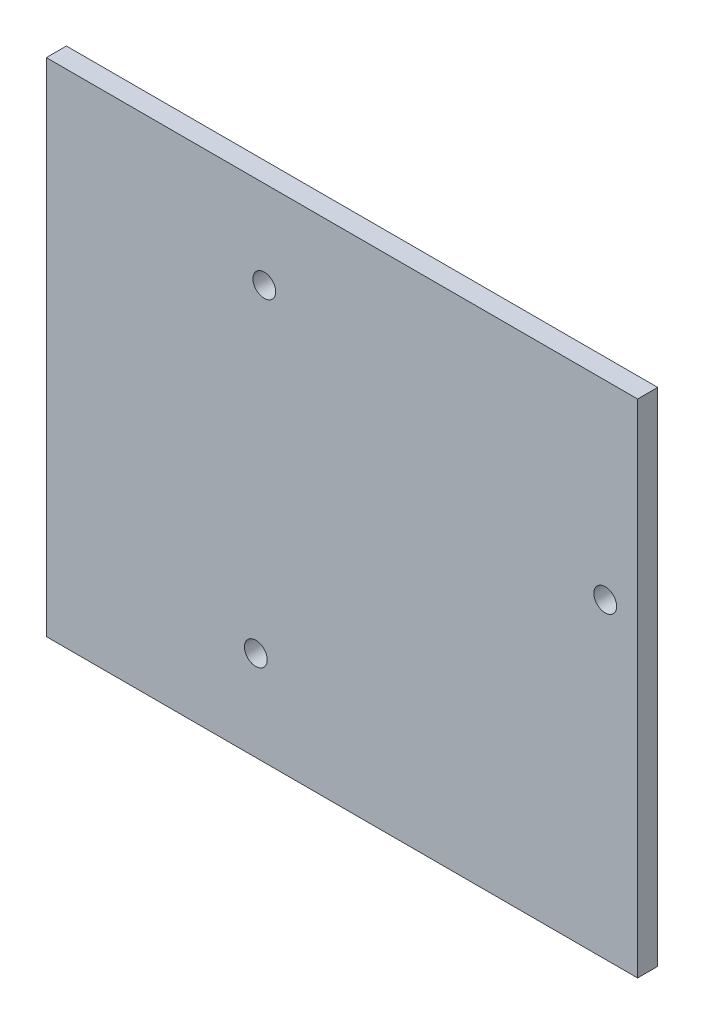
ISO-10303-21;
HEADER;
FILE_DESCRIPTION(('STEP AP214'),'2;1');
FILE_NAME('part.step','',(''),(''),'','','');
FILE_SCHEMA(('AUTOMOTIVE_DESIGN { 1 0 10303 214 1 1 1 1 }'));
ENDSEC;
DATA;
#1=APPLICATION_CONTEXT('core data for automotive mechanical design processes');
#2=APPLICATION_PROTOCOL_DEFINITION('international standard','automotive_design',2000,#1);
#3=PRODUCT_CONTEXT('',#1,'mechanical');
#4=PRODUCT('Part','Part','',(#3));
#5=PRODUCT_RELATED_PRODUCT_CATEGORY('part','',(#4));
#6=PRODUCT_DEFINITION_FORMATION('','',#4);
#7=PRODUCT_DEFINITION_CONTEXT('part definition',#1,'design');
#8=PRODUCT_DEFINITION('design','',#6,#7);
#9=PRODUCT_DEFINITION_SHAPE('','',#8);
#10=(LENGTH_UNIT() NAMED_UNIT(*) SI_UNIT(.MILLI.,.METRE.));
#11=(NAMED_UNIT(*) PLANE_ANGLE_UNIT() SI_UNIT($,.RADIAN.));
#12=(NAMED_UNIT(*) SI_UNIT($,.STERADIAN.) SOLID_ANGLE_UNIT());
#13=UNCERTAINTY_MEASURE_WITH_UNIT(LENGTH_MEASURE(1.E-05),#10,'distance_accuracy_value','');
#14=(GEOMETRIC_REPRESENTATION_CONTEXT(3) GLOBAL_UNCERTAINTY_ASSIGNED_CONTEXT((#13)) GLOBAL_UNIT_ASSIGNED_CONTEXT((#10,
#11,#12)) REPRESENTATION_CONTEXT('',''));
#15=CARTESIAN_POINT('',(0.,0.,0.));
#16=DIRECTION('',(0.,0.,1.));
#17=DIRECTION('',(1.,0.,0.));
#18=AXIS2_PLACEMENT_3D('',#15,#16,#17);
#19=CARTESIAN_POINT('',(30.9366243594386,-37.6115753760681,-3.));
#20=DIRECTION('',(1.,0.,0.));
#21=DIRECTION('',(0.,0.,-1.));
#22=AXIS2_PLACEMENT_3D('',#19,#20,#21);
#23=PLANE('',#22);
#24=DIRECTION('',(0.,1.,0.));
#25=VECTOR('',#24,1.);
#26=CARTESIAN_POINT('',(30.9366243594386,-37.6115753760681,0.));
#27=LINE('',#26,#25);
#28=CARTESIAN_POINT('',(30.9366243594386,-37.6115753760681,0.));
#29=VERTEX_POINT('',#28);
#30=CARTESIAN_POINT('',(30.9366243594386,37.2919327887527,0.));
#31=VERTEX_POINT('',#30);
#32=EDGE_CURVE('E98',#29,#31,#27,.T.);
#33=ORIENTED_EDGE('',*,*,#32,.F.);
#34=DIRECTION('',(0.,0.,1.));
#35=VECTOR('',#34,1.);
#36=CARTESIAN_POINT('',(30.9366243594386,-37.6115753760681,-3.));
#37=LINE('',#36,#35);
#38=CARTESIAN_POINT('',(30.9366243594386,-37.6115753760681,-3.));
#39=VERTEX_POINT('',#38);
#40=EDGE_CURVE('E11',#39,#29,#37,.T.);
#41=ORIENTED_EDGE('',*,*,#40,.F.);
#42=DIRECTION('',(0.,1.,0.));
#43=VECTOR('',#42,1.);
#44=CARTESIAN_POINT('',(30.9366243594386,-37.6115753760681,-3.));
#45=LINE('',#44,#43);
#46=CARTESIAN_POINT('',(30.9366243594386,37.2919327887527,-3.));
#47=VERTEX_POINT('',#46);
#48=EDGE_CURVE('E91',#39,#47,#45,.T.);
#49=ORIENTED_EDGE('',*,*,#48,.T.);
#50=DIRECTION('',(0.,0.,1.));
#51=VECTOR('',#50,1.);
#52=CARTESIAN_POINT('',(30.9366243594386,37.2919327887527,-3.));
#53=LINE('',#52,#51);
#54=EDGE_CURVE('E36',#47,#31,#53,.T.);
#55=ORIENTED_EDGE('',*,*,#54,.T.);
#56=EDGE_LOOP('',(#33,#41,#49,#55));
#57=FACE_BOUND('',#56,.T.);
#58=ADVANCED_FACE('F33',(#57),#23,.T.);
#59=CARTESIAN_POINT('',(30.9366243594386,-37.6115753760681,-3.));
#60=DIRECTION('',(0.,-1.,0.));
#61=DIRECTION('',(0.,0.,-1.));
#62=AXIS2_PLACEMENT_3D('',#59,#60,#61);
#63=PLANE('',#62);
#64=DIRECTION('',(1.,0.,0.));
#65=VECTOR('',#64,1.);
#66=CARTESIAN_POINT('',(30.9366243594386,-37.6115753760681,0.));
#67=LINE('',#66,#65);
#68=CARTESIAN_POINT('',(-57.3919791521353,-37.6115753760681,0.));
#69=VERTEX_POINT('',#68);
#70=EDGE_CURVE('E93',#69,#29,#67,.T.);
#71=ORIENTED_EDGE('',*,*,#70,.F.);
#72=DIRECTION('',(0.,0.,1.));
#73=VECTOR('',#72,1.);
#74=CARTESIAN_POINT('',(-57.3919791521353,-37.6115753760681,-3.));
#75=LINE('',#74,#73);
#76=CARTESIAN_POINT('',(-57.3919791521353,-37.6115753760681,-3.));
#77=VERTEX_POINT('',#76);
#78=EDGE_CURVE('E42',#77,#69,#75,.T.);
#79=ORIENTED_EDGE('',*,*,#78,.F.);
#80=DIRECTION('',(1.,0.,0.));
#81=VECTOR('',#80,1.);
#82=CARTESIAN_POINT('',(30.9366243594386,-37.6115753760681,-3.));
#83=LINE('',#82,#81);
#84=EDGE_CURVE('E88',#77,#39,#83,.T.);
#85=ORIENTED_EDGE('',*,*,#84,.T.);
#86=ORIENTED_EDGE('',*,*,#40,.T.);
#87=EDGE_LOOP('',(#71,#79,#85,#86));
#88=FACE_BOUND('',#87,.T.);
#89=ADVANCED_FACE('F109',(#88),#63,.T.);
#90=CARTESIAN_POINT('',(-57.3919791521353,-37.6115753760681,-3.));
#91=DIRECTION('',(-1.,0.,0.));
#92=DIRECTION('',(0.,0.,1.));
#93=AXIS2_PLACEMENT_3D('',#90,#91,#92);
#94=PLANE('',#93);
#95=DIRECTION('',(0.,-1.,0.));
#96=VECTOR('',#95,1.);
#97=CARTESIAN_POINT('',(-57.3919791521353,-37.6115753760681,0.));
#98=LINE('',#97,#96);
#99=CARTESIAN_POINT('',(-57.3919791521353,37.2919327887527,0.));
#100=VERTEX_POINT('',#99);
#101=EDGE_CURVE('E83',#100,#69,#98,.T.);
#102=ORIENTED_EDGE('',*,*,#101,.F.);
#103=DIRECTION('',(0.,0.,1.));
#104=VECTOR('',#103,1.);
#105=CARTESIAN_POINT('',(-57.3919791521353,37.2919327887527,-3.));
#106=LINE('',#105,#104);
#107=CARTESIAN_POINT('',(-57.3919791521353,37.2919327887527,-3.));
#108=VERTEX_POINT('',#107);
#109=EDGE_CURVE('E78',#108,#100,#106,.T.);
#110=ORIENTED_EDGE('',*,*,#109,.F.);
#111=DIRECTION('',(0.,-1.,0.));
#112=VECTOR('',#111,1.);
#113=CARTESIAN_POINT('',(-57.3919791521353,-37.6115753760681,-3.));
#114=LINE('',#113,#112);
#115=EDGE_CURVE('E81',#108,#77,#114,.T.);
#116=ORIENTED_EDGE('',*,*,#115,.T.);
#117=ORIENTED_EDGE('',*,*,#78,.T.);
#118=EDGE_LOOP('',(#102,#110,#116,#117));
#119=FACE_BOUND('',#118,.T.);
#120=ADVANCED_FACE('F80',(#119),#94,.T.);
#121=CARTESIAN_POINT('',(30.9366243594386,37.2919327887527,-3.));
#122=DIRECTION('',(0.,1.,0.));
#123=DIRECTION('',(0.,0.,1.));
#124=AXIS2_PLACEMENT_3D('',#121,#122,#123);
#125=PLANE('',#124);
#126=DIRECTION('',(-1.,0.,0.));
#127=VECTOR('',#126,1.);
#128=CARTESIAN_POINT('',(30.9366243594386,37.2919327887527,0.));
#129=LINE('',#128,#127);
#130=EDGE_CURVE('E101',#31,#100,#129,.T.);
#131=ORIENTED_EDGE('',*,*,#130,.F.);
#132=ORIENTED_EDGE('',*,*,#54,.F.);
#133=DIRECTION('',(-1.,0.,0.));
#134=VECTOR('',#133,1.);
#135=CARTESIAN_POINT('',(30.9366243594386,37.2919327887527,-3.));
#136=LINE('',#135,#134);
#137=EDGE_CURVE('E87',#47,#108,#136,.T.);
#138=ORIENTED_EDGE('',*,*,#137,.T.);
#139=ORIENTED_EDGE('',*,*,#109,.T.);
#140=EDGE_LOOP('',(#131,#132,#138,#139));
#141=FACE_BOUND('',#140,.T.);
#142=ADVANCED_FACE('F90',(#141),#125,.T.);
#143=CARTESIAN_POINT('',(0.,0.,-3.));
#144=DIRECTION('',(0.,0.,1.));
#145=DIRECTION('',(1.,0.,0.));
#146=AXIS2_PLACEMENT_3D('',#143,#144,#145);
#147=PLANE('',#146);
#148=CARTESIAN_POINT('',(26.095,8.89,-3.));
#149=DIRECTION('',(0.,0.,1.));
#150=DIRECTION('',(1.,0.,0.));
#151=AXIS2_PLACEMENT_3D('',#148,#149,#150);
#152=CIRCLE('',#151,1.69999999999999);
#153=CARTESIAN_POINT('',(27.795,8.89,-3.));
#154=VERTEX_POINT('',#153);
#155=EDGE_CURVE('E146',#154,#154,#152,.T.);
#156=ORIENTED_EDGE('',*,*,#155,.T.);
#157=EDGE_LOOP('',(#156));
#158=FACE_BOUND('',#157,.T.);
#159=CARTESIAN_POINT('',(-24.825,24.13,-3.));
#160=DIRECTION('',(0.,0.,1.));
#161=DIRECTION('',(1.,0.,0.));
#162=AXIS2_PLACEMENT_3D('',#159,#160,#161);
#163=CIRCLE('',#162,1.69999999999999);
#164=CARTESIAN_POINT('',(-23.125,24.13,-3.));
#165=VERTEX_POINT('',#164);
#166=EDGE_CURVE('E156',#165,#165,#163,.T.);
#167=ORIENTED_EDGE('',*,*,#166,.T.);
#168=EDGE_LOOP('',(#167));
#169=FACE_BOUND('',#168,.T.);
#170=CARTESIAN_POINT('',(-26.095,-24.13,-3.));
#171=DIRECTION('',(0.,0.,1.));
#172=DIRECTION('',(1.,0.,0.));
#173=AXIS2_PLACEMENT_3D('',#170,#171,#172);
#174=CIRCLE('',#173,1.69999999999999);
#175=CARTESIAN_POINT('',(-24.395,-24.13,-3.));
#176=VERTEX_POINT('',#175);
#177=EDGE_CURVE('E102',#176,#176,#174,.T.);
#178=ORIENTED_EDGE('',*,*,#177,.T.);
#179=EDGE_LOOP('',(#178));
#180=FACE_BOUND('',#179,.T.);
#181=ORIENTED_EDGE('',*,*,#48,.F.);
#182=ORIENTED_EDGE('',*,*,#84,.F.);
#183=ORIENTED_EDGE('',*,*,#115,.F.);
#184=ORIENTED_EDGE('',*,*,#137,.F.);
#185=EDGE_LOOP('',(#181,#182,#183,#184));
#186=FACE_BOUND('',#185,.T.);
#187=ADVANCED_FACE('F86',(#158,#169,#180,#186),#147,.F.);
#188=CARTESIAN_POINT('',(0.,0.,0.));
#189=DIRECTION('',(0.,0.,1.));
#190=DIRECTION('',(1.,0.,0.));
#191=AXIS2_PLACEMENT_3D('',#188,#189,#190);
#192=PLANE('',#191);
#193=CARTESIAN_POINT('',(26.095,8.89,0.));
#194=DIRECTION('',(0.,0.,1.));
#195=DIRECTION('',(1.,0.,0.));
#196=AXIS2_PLACEMENT_3D('',#193,#194,#195);
#197=CIRCLE('',#196,1.69999999999999);
#198=CARTESIAN_POINT('',(27.795,8.89,0.));
#199=VERTEX_POINT('',#198);
#200=EDGE_CURVE('E149',#199,#199,#197,.T.);
#201=ORIENTED_EDGE('',*,*,#200,.F.);
#202=EDGE_LOOP('',(#201));
#203=FACE_BOUND('',#202,.T.);
#204=CARTESIAN_POINT('',(-24.825,24.13,0.));
#205=DIRECTION('',(0.,0.,1.));
#206=DIRECTION('',(1.,0.,0.));
#207=AXIS2_PLACEMENT_3D('',#204,#205,#206);
#208=CIRCLE('',#207,1.69999999999999);
#209=CARTESIAN_POINT('',(-23.125,24.13,0.));
#210=VERTEX_POINT('',#209);
#211=EDGE_CURVE('E151',#210,#210,#208,.T.);
#212=ORIENTED_EDGE('',*,*,#211,.F.);
#213=EDGE_LOOP('',(#212));
#214=FACE_BOUND('',#213,.T.);
#215=CARTESIAN_POINT('',(-26.095,-24.13,0.));
#216=DIRECTION('',(0.,0.,1.));
#217=DIRECTION('',(1.,0.,0.));
#218=AXIS2_PLACEMENT_3D('',#215,#216,#217);
#219=CIRCLE('',#218,1.69999999999999);
#220=CARTESIAN_POINT('',(-24.395,-24.13,0.));
#221=VERTEX_POINT('',#220);
#222=EDGE_CURVE('E159',#221,#221,#219,.T.);
#223=ORIENTED_EDGE('',*,*,#222,.F.);
#224=EDGE_LOOP('',(#223));
#225=FACE_BOUND('',#224,.T.);
#226=ORIENTED_EDGE('',*,*,#32,.T.);
#227=ORIENTED_EDGE('',*,*,#130,.T.);
#228=ORIENTED_EDGE('',*,*,#101,.T.);
#229=ORIENTED_EDGE('',*,*,#70,.T.);
#230=EDGE_LOOP('',(#226,#227,#228,#229));
#231=FACE_BOUND('',#230,.T.);
#232=ADVANCED_FACE('F108',(#203,#214,#225,#231),#192,.T.);
#233=CARTESIAN_POINT('',(-26.095,-24.13,0.));
#234=DIRECTION('',(0.,0.,1.));
#235=DIRECTION('',(1.,0.,0.));
#236=AXIS2_PLACEMENT_3D('',#233,#234,#235);
#237=CYLINDRICAL_SURFACE('',#236,1.69999999999999);
#238=ORIENTED_EDGE('',*,*,#177,.F.);
#239=EDGE_LOOP('',(#238));
#240=FACE_BOUND('',#239,.T.);
#241=ORIENTED_EDGE('',*,*,#222,.T.);
#242=EDGE_LOOP('',(#241));
#243=FACE_BOUND('',#242,.T.);
#244=ADVANCED_FACE('F127',(#240,#243),#237,.F.);
#245=CARTESIAN_POINT('',(-24.825,24.13,0.));
#246=DIRECTION('',(0.,0.,1.));
#247=DIRECTION('',(1.,0.,0.));
#248=AXIS2_PLACEMENT_3D('',#245,#246,#247);
#249=CYLINDRICAL_SURFACE('',#248,1.69999999999999);
#250=ORIENTED_EDGE('',*,*,#166,.F.);
#251=EDGE_LOOP('',(#250));
#252=FACE_BOUND('',#251,.T.);
#253=ORIENTED_EDGE('',*,*,#211,.T.);
#254=EDGE_LOOP('',(#253));
#255=FACE_BOUND('',#254,.T.);
#256=ADVANCED_FACE('F134',(#252,#255),#249,.F.);
#257=CARTESIAN_POINT('',(26.095,8.89,0.));
#258=DIRECTION('',(0.,0.,1.));
#259=DIRECTION('',(1.,0.,0.));
#260=AXIS2_PLACEMENT_3D('',#257,#258,#259);
#261=CYLINDRICAL_SURFACE('',#260,1.69999999999999);
#262=ORIENTED_EDGE('',*,*,#155,.F.);
#263=EDGE_LOOP('',(#262));
#264=FACE_BOUND('',#263,.T.);
#265=ORIENTED_EDGE('',*,*,#200,.T.);
#266=EDGE_LOOP('',(#265));
#267=FACE_BOUND('',#266,.T.);
#268=ADVANCED_FACE('F138',(#264,#267),#261,.F.);
#269=CLOSED_SHELL('',(#58,#89,#120,#142,#187,#232,#244,#256,#268));
#270=MANIFOLD_SOLID_BREP('B2',#269);
#271=ADVANCED_BREP_SHAPE_REPRESENTATION('',(#18,#270),#14);
#272=SHAPE_DEFINITION_REPRESENTATION(#9,#271);
ENDSEC;
END-ISO-10303-21;
